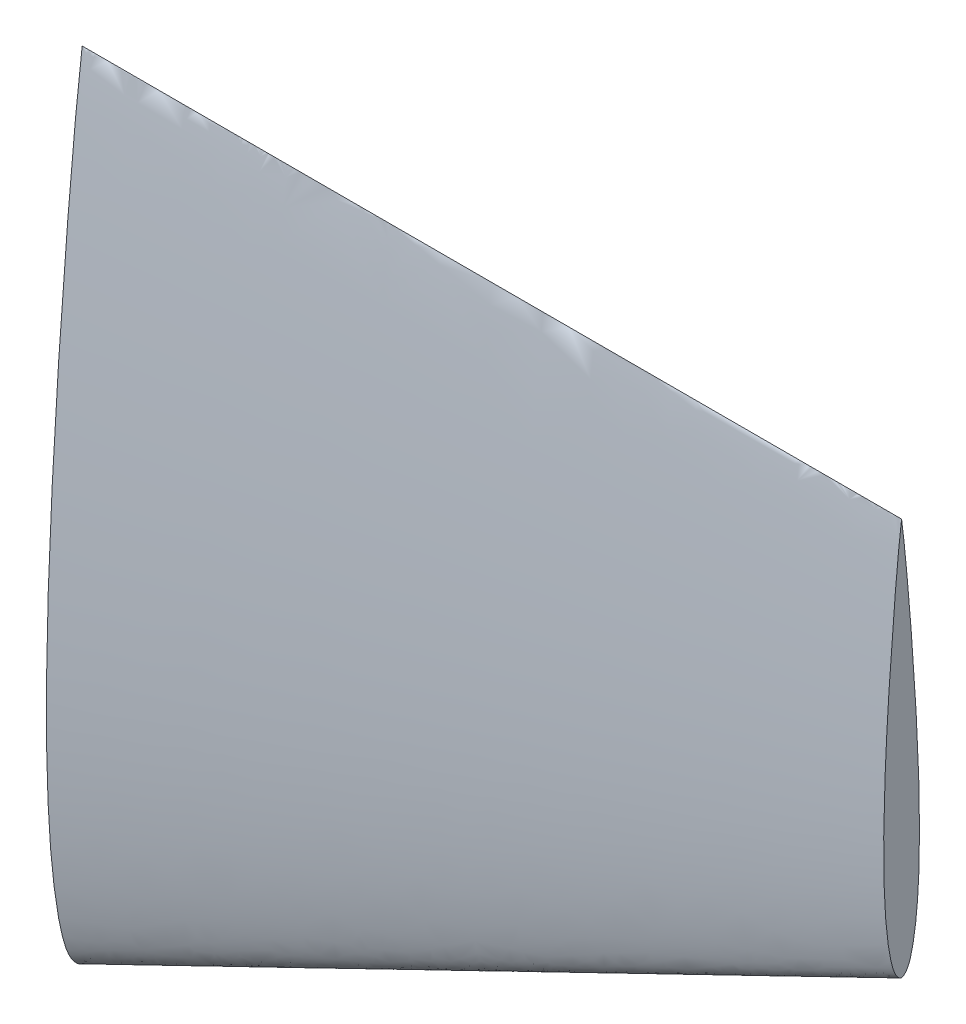
ISO-10303-21;
HEADER;
FILE_DESCRIPTION(('STEP AP214'),'2;1');
FILE_NAME('part.step','',(''),(''),'','','');
FILE_SCHEMA(('AUTOMOTIVE_DESIGN { 1 0 10303 214 1 1 1 1 }'));
ENDSEC;
DATA;
#1=APPLICATION_CONTEXT('core data for automotive mechanical design processes');
#2=APPLICATION_PROTOCOL_DEFINITION('international standard','automotive_design',2000,#1);
#3=PRODUCT_CONTEXT('',#1,'mechanical');
#4=PRODUCT('Part','Part','',(#3));
#5=PRODUCT_RELATED_PRODUCT_CATEGORY('part','',(#4));
#6=PRODUCT_DEFINITION_FORMATION('','',#4);
#7=PRODUCT_DEFINITION_CONTEXT('part definition',#1,'design');
#8=PRODUCT_DEFINITION('design','',#6,#7);
#9=PRODUCT_DEFINITION_SHAPE('','',#8);
#10=(LENGTH_UNIT() NAMED_UNIT(*) SI_UNIT(.MILLI.,.METRE.));
#11=(NAMED_UNIT(*) PLANE_ANGLE_UNIT() SI_UNIT($,.RADIAN.));
#12=(NAMED_UNIT(*) SI_UNIT($,.STERADIAN.) SOLID_ANGLE_UNIT());
#13=UNCERTAINTY_MEASURE_WITH_UNIT(LENGTH_MEASURE(1.E-05),#10,'distance_accuracy_value','');
#14=(GEOMETRIC_REPRESENTATION_CONTEXT(3) GLOBAL_UNCERTAINTY_ASSIGNED_CONTEXT((#13)) GLOBAL_UNIT_ASSIGNED_CONTEXT((#10,
#11,#12)) REPRESENTATION_CONTEXT('',''));
#15=CARTESIAN_POINT('',(0.,0.,0.));
#16=DIRECTION('',(0.,0.,1.));
#17=DIRECTION('',(1.,0.,0.));
#18=AXIS2_PLACEMENT_3D('',#15,#16,#17);
#19=CARTESIAN_POINT('',(0.,114.4,0.));
#20=CARTESIAN_POINT('',(118.,114.4,0.));
#21=CARTESIAN_POINT('',(0.,114.4,0.0072838324299916));
#22=CARTESIAN_POINT('',(118.,114.4,0.0036419162149958));
#23=CARTESIAN_POINT('',(0.,114.211630690469,0.0218488366554333));
#24=CARTESIAN_POINT('',(118.,114.305815345234,0.0109244183277166));
#25=CARTESIAN_POINT('',(0.,114.080118646882,0.0436282467660752));
#26=CARTESIAN_POINT('',(118.,114.240059323441,0.0218141233830376));
#27=CARTESIAN_POINT('',(0.,113.796890954845,0.0795142857198553));
#28=CARTESIAN_POINT('',(118.,114.098445477423,0.0397571428599277));
#29=CARTESIAN_POINT('',(0.,113.426193350975,0.128529824167782));
#30=CARTESIAN_POINT('',(118.,113.913096675488,0.0642649120838911));
#31=CARTESIAN_POINT('',(0.,112.936855293923,0.189766940480201));
#32=CARTESIAN_POINT('',(118.,113.668427646962,0.0948834702401005));
#33=CARTESIAN_POINT('',(0.,112.346166999731,0.26242898975721));
#34=CARTESIAN_POINT('',(118.,113.373083499866,0.131214494878605));
#35=CARTESIAN_POINT('',(0.,110.280049707971,0.510194469718378));
#36=CARTESIAN_POINT('',(118.,112.340024853985,0.255097234859189));
#37=CARTESIAN_POINT('',(0.,105.348652112069,1.03610984584126));
#38=CARTESIAN_POINT('',(118.,109.874326056034,0.518054922920632));
#39=CARTESIAN_POINT('',(0.,98.8040196091008,1.64696029330674));
#40=CARTESIAN_POINT('',(118.,106.60200980455,0.823480146653369));
#41=CARTESIAN_POINT('',(0.,89.5887480019146,2.43856623380089));
#42=CARTESIAN_POINT('',(118.,101.994374000957,1.21928311690045));
#43=CARTESIAN_POINT('',(0.,78.5982409417213,3.29258826974691));
#44=CARTESIAN_POINT('',(118.,96.4991204708606,1.64629413487346));
#45=CARTESIAN_POINT('',(0.,64.5036725694726,4.21318410153266));
#46=CARTESIAN_POINT('',(118.,89.4518362847363,2.10659205076633));
#47=CARTESIAN_POINT('',(0.,49.9099778334894,4.91417535466658));
#48=CARTESIAN_POINT('',(118.,82.1549889167447,2.45708767733329));
#49=CARTESIAN_POINT('',(0.,38.9834810391131,5.16800984998526));
#50=CARTESIAN_POINT('',(118.,76.6917405195565,2.58400492499263));
#51=CARTESIAN_POINT('',(0.,31.9372793334657,5.15962957711146));
#52=CARTESIAN_POINT('',(118.,73.1686396667329,2.57981478855573));
#53=CARTESIAN_POINT('',(0.,28.6404540388475,5.11574905672803));
#54=CARTESIAN_POINT('',(118.,71.5202270194238,2.55787452836402));
#55=CARTESIAN_POINT('',(0.,25.4659165086855,5.03886157181797));
#56=CARTESIAN_POINT('',(118.,69.9329582543428,2.51943078590898));
#57=CARTESIAN_POINT('',(0.,21.5153111318161,4.88773266252852));
#58=CARTESIAN_POINT('',(118.,67.957655565908,2.44386633126426));
#59=CARTESIAN_POINT('',(0.,16.2443484888754,4.57614430828349));
#60=CARTESIAN_POINT('',(118.,65.3221742444377,2.28807215414175));
#61=CARTESIAN_POINT('',(0.,11.3358377518641,4.06351264731328));
#62=CARTESIAN_POINT('',(118.,62.8679188759321,2.03175632365664));
#63=CARTESIAN_POINT('',(0.,7.72888536307538,3.48002988666406));
#64=CARTESIAN_POINT('',(118.,61.0644426815377,1.74001494333203));
#65=CARTESIAN_POINT('',(0.,5.96469851713171,3.13738551279787));
#66=CARTESIAN_POINT('',(118.,60.1823492585659,1.56869275639894));
#67=CARTESIAN_POINT('',(0.,4.41708138247386,2.77256415689025));
#68=CARTESIAN_POINT('',(118.,59.4085406912369,1.38628207844513));
#69=CARTESIAN_POINT('',(0.,3.09328338163604,2.37333821699482));
#70=CARTESIAN_POINT('',(118.,58.746641690818,1.18666910849741));
#71=CARTESIAN_POINT('',(0.,1.91416621401265,1.89926931885839));
#72=CARTESIAN_POINT('',(118.,58.1570831070063,0.949634659429197));
#73=CARTESIAN_POINT('',(0.,1.05954476476886,1.39762010102772));
#74=CARTESIAN_POINT('',(118.,57.7297723823844,0.69881005051386));
#75=CARTESIAN_POINT('',(0.,0.512892322559978,0.915140017273878));
#76=CARTESIAN_POINT('',(118.,57.45644616128,0.457570008636939));
#77=CARTESIAN_POINT('',(0.,0.262612740546847,0.629628981385082));
#78=CARTESIAN_POINT('',(118.,57.3313063702734,0.314814490692541));
#79=CARTESIAN_POINT('',(0.,0.104439841482338,0.378528288285168));
#80=CARTESIAN_POINT('',(118.,57.2522199207412,0.189264144142584));
#81=CARTESIAN_POINT('',(0.,0.0187876580989688,0.186587242264394));
#82=CARTESIAN_POINT('',(118.,57.2093938290495,0.0932936211321971));
#83=CARTESIAN_POINT('',(0.,-0.00614084997411463,0.));
#84=CARTESIAN_POINT('',(118.,57.1969295750129,0.));
#85=CARTESIAN_POINT('',(0.,0.0187876580989704,-0.186587242264419));
#86=CARTESIAN_POINT('',(118.,57.2093938290495,-0.0932936211322096));
#87=CARTESIAN_POINT('',(0.,0.104439841482325,-0.378528288285144));
#88=CARTESIAN_POINT('',(118.,57.2522199207412,-0.189264144142572));
#89=CARTESIAN_POINT('',(0.,0.26261274054685,-0.629628981385088));
#90=CARTESIAN_POINT('',(118.,57.3313063702734,-0.314814490692544));
#91=CARTESIAN_POINT('',(0.,0.512892322560023,-0.915140017273927));
#92=CARTESIAN_POINT('',(118.,57.45644616128,-0.457570008636963));
#93=CARTESIAN_POINT('',(0.,1.05954476476881,-1.39762010102767));
#94=CARTESIAN_POINT('',(118.,57.7297723823844,-0.698810050513834));
#95=CARTESIAN_POINT('',(0.,1.91416621401266,-1.8992693188584));
#96=CARTESIAN_POINT('',(118.,58.1570831070064,-0.9496346594292));
#97=CARTESIAN_POINT('',(0.,3.09328338163609,-2.37333821699484));
#98=CARTESIAN_POINT('',(118.,58.746641690818,-1.18666910849742));
#99=CARTESIAN_POINT('',(0.,4.41708138247385,-2.77256415689025));
#100=CARTESIAN_POINT('',(118.,59.4085406912369,-1.38628207844513));
#101=CARTESIAN_POINT('',(0.,5.96469851713164,-3.13738551279786));
#102=CARTESIAN_POINT('',(118.,60.1823492585658,-1.56869275639893));
#103=CARTESIAN_POINT('',(0.,7.72888536307529,-3.48002988666405));
#104=CARTESIAN_POINT('',(118.,61.0644426815376,-1.74001494333202));
#105=CARTESIAN_POINT('',(0.,11.3358377518643,-4.06351264731332));
#106=CARTESIAN_POINT('',(118.,62.8679188759322,-2.03175632365666));
#107=CARTESIAN_POINT('',(0.,16.2443484888753,-4.57614430828348));
#108=CARTESIAN_POINT('',(118.,65.3221742444378,-2.28807215414174));
#109=CARTESIAN_POINT('',(0.,21.515311131816,-4.88773266252852));
#110=CARTESIAN_POINT('',(118.,67.957655565908,-2.44386633126426));
#111=CARTESIAN_POINT('',(0.,25.4659165086855,-5.03886157181797));
#112=CARTESIAN_POINT('',(118.,69.9329582543428,-2.51943078590898));
#113=CARTESIAN_POINT('',(0.,28.6404540388475,-5.11574905672804));
#114=CARTESIAN_POINT('',(118.,71.5202270194237,-2.55787452836402));
#115=CARTESIAN_POINT('',(0.,31.9372793334656,-5.15962957711145));
#116=CARTESIAN_POINT('',(118.,73.1686396667328,-2.57981478855572));
#117=CARTESIAN_POINT('',(0.,38.9834810391131,-5.16800984998528));
#118=CARTESIAN_POINT('',(118.,76.6917405195565,-2.58400492499264));
#119=CARTESIAN_POINT('',(0.,49.9099778334897,-4.91417535466658));
#120=CARTESIAN_POINT('',(118.,82.1549889167448,-2.45708767733329));
#121=CARTESIAN_POINT('',(0.,64.5036725694725,-4.21318410153266));
#122=CARTESIAN_POINT('',(118.,89.4518362847363,-2.10659205076633));
#123=CARTESIAN_POINT('',(0.,78.5982409417211,-3.29258826974692));
#124=CARTESIAN_POINT('',(118.,96.4991204708607,-1.64629413487346));
#125=CARTESIAN_POINT('',(0.,89.5887480019146,-2.43856623380088));
#126=CARTESIAN_POINT('',(118.,101.994374000957,-1.21928311690044));
#127=CARTESIAN_POINT('',(0.,98.8040196091008,-1.64696029330675));
#128=CARTESIAN_POINT('',(118.,106.60200980455,-0.823480146653373));
#129=CARTESIAN_POINT('',(0.,105.348652112069,-1.03610984584126));
#130=CARTESIAN_POINT('',(118.,109.874326056035,-0.51805492292063));
#131=CARTESIAN_POINT('',(0.,110.280049707971,-0.510194469718387));
#132=CARTESIAN_POINT('',(118.,112.340024853985,-0.255097234859193));
#133=CARTESIAN_POINT('',(0.,112.346166999731,-0.262428989757209));
#134=CARTESIAN_POINT('',(118.,113.373083499866,-0.131214494878604));
#135=CARTESIAN_POINT('',(0.,112.936855293923,-0.189766940480202));
#136=CARTESIAN_POINT('',(118.,113.668427646961,-0.0948834702401012));
#137=CARTESIAN_POINT('',(0.,113.426193350975,-0.12852982416778));
#138=CARTESIAN_POINT('',(118.,113.913096675488,-0.0642649120838899));
#139=CARTESIAN_POINT('',(0.,113.796890954845,-0.0795142857198586));
#140=CARTESIAN_POINT('',(118.,114.098445477423,-0.0397571428599293));
#141=CARTESIAN_POINT('',(0.,114.080118646882,-0.043628246766073));
#142=CARTESIAN_POINT('',(118.,114.240059323441,-0.0218141233830365));
#143=CARTESIAN_POINT('',(0.,114.211630690469,-0.0218488366554367));
#144=CARTESIAN_POINT('',(118.,114.305815345234,-0.0109244183277184));
#145=CARTESIAN_POINT('',(0.,114.4,-0.00728383242999128));
#146=CARTESIAN_POINT('',(118.,114.4,-0.00364191621499564));
#147=CARTESIAN_POINT('',(0.,114.4,0.));
#148=CARTESIAN_POINT('',(118.,114.4,0.));
#149=B_SPLINE_SURFACE_WITH_KNOTS('',3,1,((#19,#20),(#21,#22),(#23,#24),(#25,#26),(#27,#28),(#29,
#30),(#31,#32),(#33,#34),(#35,#36),(#37,#38),(#39,#40),(#41,#42),(#43,#44),(#45,#46),(#47,#48),
(#49,#50),(#51,#52),(#53,#54),(#55,#56),(#57,#58),(#59,#60),(#61,#62),(#63,#64),(#65,#66),(#67,
#68),(#69,#70),(#71,#72),(#73,#74),(#75,#76),(#77,#78),(#79,#80),(#81,#82),(#83,#84),(#85,#86),
(#87,#88),(#89,#90),(#91,#92),(#93,#94),(#95,#96),(#97,#98),(#99,#100),(#101,#102),(#103,#104),
(#105,#106),(#107,#108),(#109,#110),(#111,#112),(#113,#114),(#115,#116),(#117,#118),(#119,#120),
(#121,#122),(#123,#124),(#125,#126),(#127,#128),(#129,#130),(#131,#132),(#133,#134),(#135,#136),
(#137,#138),(#139,#140),(#141,#142),(#143,#144),(#145,#146),(#147,#148)),.UNSPECIFIED.,.T.,.F.,
.F.,(4,1,1,1,1,1,1,1,1,1,1,1,1,1,1,1,1,1,1,1,1,1,1,1,1,1,1,1,1,1,1,1,1,1,1,1,1,1,1,1,1,1,1,1,1,
1,1,1,1,1,1,1,1,1,1,1,1,1,1,1,1,1,4),(2,2),(0.,0.000711185839146075,0.00142211189669677,
0.00213325230730564,0.00425158120835251,0.00636919832710723,0.00848752581630524,
0.0119730784810977,0.0333165732602391,0.072750532853801,0.097133324863051,0.153150736130299,
0.215572756141474,0.280129489501461,0.342436877180773,0.35716003719228,0.371419982611637,
0.385154319352995,0.398301185339692,0.422640862362832,0.453555830037826,0.462206438132531,
0.469975829256052,0.476836911130722,0.482800105251618,0.487877314409996,0.493276037135274,
0.495568649395588,0.497302284253286,0.498179926351266,0.499405098860122,0.5,0.500594901139878,
0.501820073648735,0.502697715746714,0.504431350604412,0.506723962864726,0.512122685590004,
0.517199894748382,0.523163088869278,0.530024170743948,0.537793561867469,0.546444169962174,
0.577359137637168,0.601698814660308,0.614845680647005,0.628580017388363,0.64283996280772,
0.657563122819227,0.719870510498539,0.784427243858526,0.846849263869701,0.902866675136949,
0.927249467146199,0.966683426739761,0.988026921518902,0.991512474183695,0.993630801672893,
0.995748418791648,0.997866747692695,0.998577888103303,0.999288814160854,1.),(0.,1.),.UNSPECIFIED.);
#150=CARTESIAN_POINT('',(0.,114.4,0.));
#151=CARTESIAN_POINT('',(0.,114.4,0.0072838324299916));
#152=CARTESIAN_POINT('',(0.,114.211630690469,0.0218488366554333));
#153=CARTESIAN_POINT('',(0.,114.080118646882,0.0436282467660752));
#154=CARTESIAN_POINT('',(0.,113.796890954845,0.0795142857198553));
#155=CARTESIAN_POINT('',(0.,113.426193350975,0.128529824167782));
#156=CARTESIAN_POINT('',(0.,112.936855293923,0.189766940480201));
#157=CARTESIAN_POINT('',(0.,112.346166999731,0.26242898975721));
#158=CARTESIAN_POINT('',(0.,110.280049707971,0.510194469718378));
#159=CARTESIAN_POINT('',(0.,105.348652112069,1.03610984584126));
#160=CARTESIAN_POINT('',(0.,98.8040196091008,1.64696029330674));
#161=CARTESIAN_POINT('',(0.,89.5887480019146,2.43856623380089));
#162=CARTESIAN_POINT('',(0.,78.5982409417213,3.29258826974691));
#163=CARTESIAN_POINT('',(0.,64.5036725694726,4.21318410153266));
#164=CARTESIAN_POINT('',(0.,49.9099778334894,4.91417535466658));
#165=CARTESIAN_POINT('',(0.,38.9834810391131,5.16800984998526));
#166=CARTESIAN_POINT('',(0.,31.9372793334657,5.15962957711146));
#167=CARTESIAN_POINT('',(0.,28.6404540388475,5.11574905672803));
#168=CARTESIAN_POINT('',(0.,25.4659165086855,5.03886157181797));
#169=CARTESIAN_POINT('',(0.,21.5153111318161,4.88773266252852));
#170=CARTESIAN_POINT('',(0.,16.2443484888754,4.57614430828349));
#171=CARTESIAN_POINT('',(0.,11.3358377518641,4.06351264731328));
#172=CARTESIAN_POINT('',(0.,7.72888536307538,3.48002988666406));
#173=CARTESIAN_POINT('',(0.,5.96469851713171,3.13738551279787));
#174=CARTESIAN_POINT('',(0.,4.41708138247386,2.77256415689025));
#175=CARTESIAN_POINT('',(0.,3.09328338163604,2.37333821699482));
#176=CARTESIAN_POINT('',(0.,1.91416621401265,1.89926931885839));
#177=CARTESIAN_POINT('',(0.,1.05954476476886,1.39762010102772));
#178=CARTESIAN_POINT('',(0.,0.512892322559978,0.915140017273878));
#179=CARTESIAN_POINT('',(0.,0.262612740546847,0.629628981385082));
#180=CARTESIAN_POINT('',(0.,0.104439841482338,0.378528288285168));
#181=CARTESIAN_POINT('',(0.,0.0187876580989688,0.186587242264394));
#182=CARTESIAN_POINT('',(0.,-0.00614084997411463,0.));
#183=CARTESIAN_POINT('',(0.,0.0187876580989704,-0.186587242264419));
#184=CARTESIAN_POINT('',(0.,0.104439841482325,-0.378528288285144));
#185=CARTESIAN_POINT('',(0.,0.26261274054685,-0.629628981385088));
#186=CARTESIAN_POINT('',(0.,0.512892322560023,-0.915140017273927));
#187=CARTESIAN_POINT('',(0.,1.05954476476881,-1.39762010102767));
#188=CARTESIAN_POINT('',(0.,1.91416621401266,-1.8992693188584));
#189=CARTESIAN_POINT('',(0.,3.09328338163609,-2.37333821699484));
#190=CARTESIAN_POINT('',(0.,4.41708138247385,-2.77256415689025));
#191=CARTESIAN_POINT('',(0.,5.96469851713164,-3.13738551279786));
#192=CARTESIAN_POINT('',(0.,7.72888536307529,-3.48002988666405));
#193=CARTESIAN_POINT('',(0.,11.3358377518643,-4.06351264731332));
#194=CARTESIAN_POINT('',(0.,16.2443484888753,-4.57614430828348));
#195=CARTESIAN_POINT('',(0.,21.515311131816,-4.88773266252852));
#196=CARTESIAN_POINT('',(0.,25.4659165086855,-5.03886157181797));
#197=CARTESIAN_POINT('',(0.,28.6404540388475,-5.11574905672804));
#198=CARTESIAN_POINT('',(0.,31.9372793334656,-5.15962957711145));
#199=CARTESIAN_POINT('',(0.,38.9834810391131,-5.16800984998528));
#200=CARTESIAN_POINT('',(0.,49.9099778334897,-4.91417535466658));
#201=CARTESIAN_POINT('',(0.,64.5036725694725,-4.21318410153266));
#202=CARTESIAN_POINT('',(0.,78.5982409417211,-3.29258826974692));
#203=CARTESIAN_POINT('',(0.,89.5887480019146,-2.43856623380088));
#204=CARTESIAN_POINT('',(0.,98.8040196091008,-1.64696029330675));
#205=CARTESIAN_POINT('',(0.,105.348652112069,-1.03610984584126));
#206=CARTESIAN_POINT('',(0.,110.280049707971,-0.510194469718387));
#207=CARTESIAN_POINT('',(0.,112.346166999731,-0.262428989757209));
#208=CARTESIAN_POINT('',(0.,112.936855293923,-0.189766940480202));
#209=CARTESIAN_POINT('',(0.,113.426193350975,-0.12852982416778));
#210=CARTESIAN_POINT('',(0.,113.796890954845,-0.0795142857198586));
#211=CARTESIAN_POINT('',(0.,114.080118646882,-0.043628246766073));
#212=CARTESIAN_POINT('',(0.,114.211630690469,-0.0218488366554367));
#213=CARTESIAN_POINT('',(0.,114.4,-0.00728383242999128));
#214=CARTESIAN_POINT('',(0.,114.4,0.));
#215=B_SPLINE_CURVE_WITH_KNOTS('',3,(#150,#151,#152,#153,#154,#155,#156,#157,#158,#159,#160,
#161,#162,#163,#164,#165,#166,#167,#168,#169,#170,#171,#172,#173,#174,#175,#176,#177,#178,#179,
#180,#181,#182,#183,#184,#185,#186,#187,#188,#189,#190,#191,#192,#193,#194,#195,#196,#197,#198,
#199,#200,#201,#202,#203,#204,#205,#206,#207,#208,#209,#210,#211,#212,#213,#214),.UNSPECIFIED.,
.T.,.F.,(4,1,1,1,1,1,1,1,1,1,1,1,1,1,1,1,1,1,1,1,1,1,1,1,1,1,1,1,1,1,1,1,1,1,1,1,1,1,1,1,1,1,1,
1,1,1,1,1,1,1,1,1,1,1,1,1,1,1,1,1,1,1,4),(0.,0.000711185839146075,0.00142211189669677,
0.00213325230730564,0.00425158120835251,0.00636919832710723,0.00848752581630524,
0.0119730784810977,0.0333165732602391,0.072750532853801,0.097133324863051,0.153150736130299,
0.215572756141474,0.280129489501461,0.342436877180773,0.35716003719228,0.371419982611637,
0.385154319352995,0.398301185339692,0.422640862362832,0.453555830037826,0.462206438132531,
0.469975829256052,0.476836911130722,0.482800105251618,0.487877314409996,0.493276037135274,
0.495568649395588,0.497302284253286,0.498179926351266,0.499405098860122,0.5,0.500594901139878,
0.501820073648735,0.502697715746714,0.504431350604412,0.506723962864726,0.512122685590004,
0.517199894748382,0.523163088869278,0.530024170743948,0.537793561867469,0.546444169962174,
0.577359137637168,0.601698814660308,0.614845680647005,0.628580017388363,0.64283996280772,
0.657563122819227,0.719870510498539,0.784427243858526,0.846849263869701,0.902866675136949,
0.927249467146199,0.966683426739761,0.988026921518902,0.991512474183695,0.993630801672893,
0.995748418791648,0.997866747692695,0.998577888103303,0.999288814160854,1.),.UNSPECIFIED.);
#216=CARTESIAN_POINT('',(0.,114.4,0.));
#217=VERTEX_POINT('',#216);
#218=EDGE_CURVE('E11',#217,#217,#215,.T.);
#219=CARTESIAN_POINT('',(118.,114.4,0.));
#220=CARTESIAN_POINT('',(118.,114.4,0.0036419162149958));
#221=CARTESIAN_POINT('',(118.,114.305815345234,0.0109244183277166));
#222=CARTESIAN_POINT('',(118.,114.240059323441,0.0218141233830376));
#223=CARTESIAN_POINT('',(118.,114.098445477423,0.0397571428599277));
#224=CARTESIAN_POINT('',(118.,113.913096675488,0.0642649120838911));
#225=CARTESIAN_POINT('',(118.,113.668427646962,0.0948834702401005));
#226=CARTESIAN_POINT('',(118.,113.373083499866,0.131214494878605));
#227=CARTESIAN_POINT('',(118.,112.340024853985,0.255097234859189));
#228=CARTESIAN_POINT('',(118.,109.874326056034,0.518054922920632));
#229=CARTESIAN_POINT('',(118.,106.60200980455,0.823480146653369));
#230=CARTESIAN_POINT('',(118.,101.994374000957,1.21928311690045));
#231=CARTESIAN_POINT('',(118.,96.4991204708606,1.64629413487346));
#232=CARTESIAN_POINT('',(118.,89.4518362847363,2.10659205076633));
#233=CARTESIAN_POINT('',(118.,82.1549889167447,2.45708767733329));
#234=CARTESIAN_POINT('',(118.,76.6917405195565,2.58400492499263));
#235=CARTESIAN_POINT('',(118.,73.1686396667329,2.57981478855573));
#236=CARTESIAN_POINT('',(118.,71.5202270194238,2.55787452836402));
#237=CARTESIAN_POINT('',(118.,69.9329582543428,2.51943078590898));
#238=CARTESIAN_POINT('',(118.,67.957655565908,2.44386633126426));
#239=CARTESIAN_POINT('',(118.,65.3221742444377,2.28807215414175));
#240=CARTESIAN_POINT('',(118.,62.8679188759321,2.03175632365664));
#241=CARTESIAN_POINT('',(118.,61.0644426815377,1.74001494333203));
#242=CARTESIAN_POINT('',(118.,60.1823492585659,1.56869275639894));
#243=CARTESIAN_POINT('',(118.,59.4085406912369,1.38628207844513));
#244=CARTESIAN_POINT('',(118.,58.746641690818,1.18666910849741));
#245=CARTESIAN_POINT('',(118.,58.1570831070063,0.949634659429197));
#246=CARTESIAN_POINT('',(118.,57.7297723823844,0.69881005051386));
#247=CARTESIAN_POINT('',(118.,57.45644616128,0.457570008636939));
#248=CARTESIAN_POINT('',(118.,57.3313063702734,0.314814490692541));
#249=CARTESIAN_POINT('',(118.,57.2522199207412,0.189264144142584));
#250=CARTESIAN_POINT('',(118.,57.2093938290495,0.0932936211321971));
#251=CARTESIAN_POINT('',(118.,57.1969295750129,0.));
#252=CARTESIAN_POINT('',(118.,57.2093938290495,-0.0932936211322096));
#253=CARTESIAN_POINT('',(118.,57.2522199207412,-0.189264144142572));
#254=CARTESIAN_POINT('',(118.,57.3313063702734,-0.314814490692544));
#255=CARTESIAN_POINT('',(118.,57.45644616128,-0.457570008636963));
#256=CARTESIAN_POINT('',(118.,57.7297723823844,-0.698810050513834));
#257=CARTESIAN_POINT('',(118.,58.1570831070064,-0.9496346594292));
#258=CARTESIAN_POINT('',(118.,58.746641690818,-1.18666910849742));
#259=CARTESIAN_POINT('',(118.,59.4085406912369,-1.38628207844513));
#260=CARTESIAN_POINT('',(118.,60.1823492585658,-1.56869275639893));
#261=CARTESIAN_POINT('',(118.,61.0644426815376,-1.74001494333202));
#262=CARTESIAN_POINT('',(118.,62.8679188759322,-2.03175632365666));
#263=CARTESIAN_POINT('',(118.,65.3221742444378,-2.28807215414174));
#264=CARTESIAN_POINT('',(118.,67.957655565908,-2.44386633126426));
#265=CARTESIAN_POINT('',(118.,69.9329582543428,-2.51943078590898));
#266=CARTESIAN_POINT('',(118.,71.5202270194237,-2.55787452836402));
#267=CARTESIAN_POINT('',(118.,73.1686396667328,-2.57981478855572));
#268=CARTESIAN_POINT('',(118.,76.6917405195565,-2.58400492499264));
#269=CARTESIAN_POINT('',(118.,82.1549889167448,-2.45708767733329));
#270=CARTESIAN_POINT('',(118.,89.4518362847363,-2.10659205076633));
#271=CARTESIAN_POINT('',(118.,96.4991204708607,-1.64629413487346));
#272=CARTESIAN_POINT('',(118.,101.994374000957,-1.21928311690044));
#273=CARTESIAN_POINT('',(118.,106.60200980455,-0.823480146653373));
#274=CARTESIAN_POINT('',(118.,109.874326056035,-0.51805492292063));
#275=CARTESIAN_POINT('',(118.,112.340024853985,-0.255097234859193));
#276=CARTESIAN_POINT('',(118.,113.373083499866,-0.131214494878604));
#277=CARTESIAN_POINT('',(118.,113.668427646961,-0.0948834702401012));
#278=CARTESIAN_POINT('',(118.,113.913096675488,-0.0642649120838899));
#279=CARTESIAN_POINT('',(118.,114.098445477423,-0.0397571428599293));
#280=CARTESIAN_POINT('',(118.,114.240059323441,-0.0218141233830365));
#281=CARTESIAN_POINT('',(118.,114.305815345234,-0.0109244183277184));
#282=CARTESIAN_POINT('',(118.,114.4,-0.00364191621499564));
#283=CARTESIAN_POINT('',(118.,114.4,0.));
#284=B_SPLINE_CURVE_WITH_KNOTS('',3,(#219,#220,#221,#222,#223,#224,#225,#226,#227,#228,#229,
#230,#231,#232,#233,#234,#235,#236,#237,#238,#239,#240,#241,#242,#243,#244,#245,#246,#247,#248,
#249,#250,#251,#252,#253,#254,#255,#256,#257,#258,#259,#260,#261,#262,#263,#264,#265,#266,#267,
#268,#269,#270,#271,#272,#273,#274,#275,#276,#277,#278,#279,#280,#281,#282,#283),.UNSPECIFIED.,
.T.,.F.,(4,1,1,1,1,1,1,1,1,1,1,1,1,1,1,1,1,1,1,1,1,1,1,1,1,1,1,1,1,1,1,1,1,1,1,1,1,1,1,1,1,1,1,
1,1,1,1,1,1,1,1,1,1,1,1,1,1,1,1,1,1,1,4),(0.,0.000711185839146075,0.00142211189669677,
0.00213325230730564,0.00425158120835251,0.00636919832710723,0.00848752581630524,
0.0119730784810977,0.0333165732602391,0.072750532853801,0.097133324863051,0.153150736130299,
0.215572756141474,0.280129489501461,0.342436877180773,0.35716003719228,0.371419982611637,
0.385154319352995,0.398301185339692,0.422640862362832,0.453555830037826,0.462206438132531,
0.469975829256052,0.476836911130722,0.482800105251618,0.487877314409996,0.493276037135274,
0.495568649395588,0.497302284253286,0.498179926351266,0.499405098860122,0.5,0.500594901139878,
0.501820073648735,0.502697715746714,0.504431350604412,0.506723962864726,0.512122685590004,
0.517199894748382,0.523163088869278,0.530024170743948,0.537793561867469,0.546444169962174,
0.577359137637168,0.601698814660308,0.614845680647005,0.628580017388363,0.64283996280772,
0.657563122819227,0.719870510498539,0.784427243858526,0.846849263869701,0.902866675136949,
0.927249467146199,0.966683426739761,0.988026921518902,0.991512474183695,0.993630801672893,
0.995748418791648,0.997866747692695,0.998577888103303,0.999288814160854,1.),.UNSPECIFIED.);
#285=CARTESIAN_POINT('',(118.,114.4,0.));
#286=VERTEX_POINT('',#285);
#287=EDGE_CURVE('E54',#286,#286,#284,.T.);
#288=ORIENTED_EDGE('',*,*,#218,.T.);
#289=EDGE_LOOP('',(#288));
#290=FACE_BOUND('',#289,.T.);
#291=ORIENTED_EDGE('',*,*,#287,.F.);
#292=EDGE_LOOP('',(#291));
#293=FACE_BOUND('',#292,.T.);
#294=ADVANCED_FACE('F50',(#290,#293),#149,.T.);
#295=CARTESIAN_POINT('',(0.,0.,0.));
#296=DIRECTION('',(-1.,0.,0.));
#297=DIRECTION('',(0.,0.,1.));
#298=AXIS2_PLACEMENT_3D('',#295,#296,#297);
#299=PLANE('',#298);
#300=ORIENTED_EDGE('',*,*,#218,.F.);
#301=EDGE_LOOP('',(#300));
#302=FACE_BOUND('',#301,.T.);
#303=ADVANCED_FACE('F72',(#302),#299,.T.);
#304=CARTESIAN_POINT('',(118.,57.2,0.));
#305=DIRECTION('',(-1.,0.,0.));
#306=DIRECTION('',(0.,0.,1.));
#307=AXIS2_PLACEMENT_3D('',#304,#305,#306);
#308=PLANE('',#307);
#309=ORIENTED_EDGE('',*,*,#287,.T.);
#310=EDGE_LOOP('',(#309));
#311=FACE_BOUND('',#310,.T.);
#312=ADVANCED_FACE('F52',(#311),#308,.F.);
#313=CLOSED_SHELL('',(#294,#303,#312));
#314=MANIFOLD_SOLID_BREP('B2',#313);
#315=ADVANCED_BREP_SHAPE_REPRESENTATION('',(#18,#314),#14);
#316=SHAPE_DEFINITION_REPRESENTATION(#9,#315);
ENDSEC;
END-ISO-10303-21;
